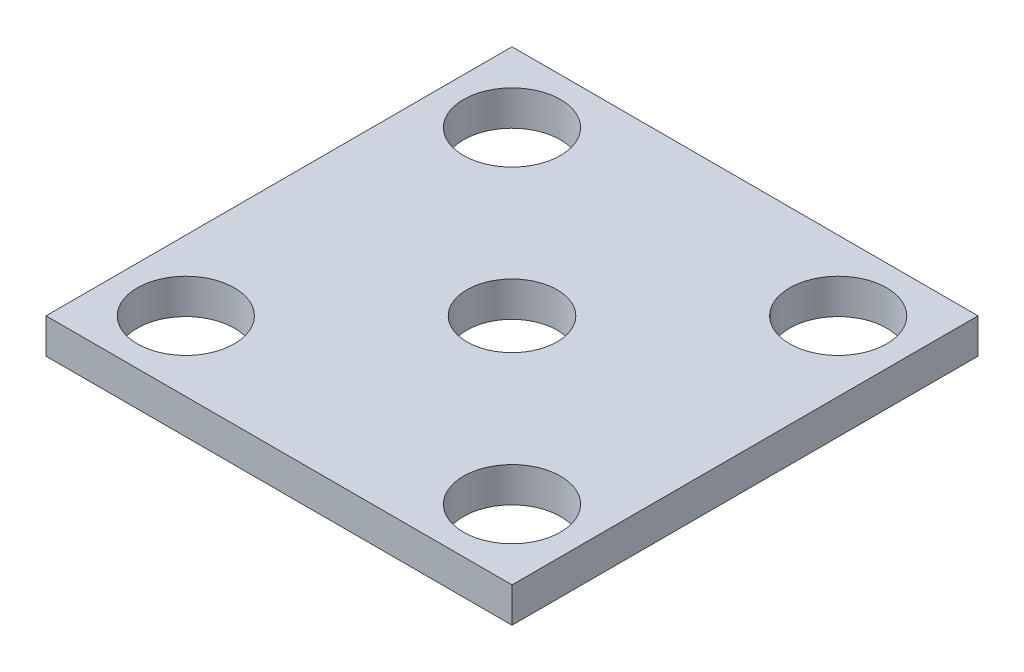
ISO-10303-21;
HEADER;
FILE_DESCRIPTION(('STEP AP214'),'2;1');
FILE_NAME('part.step','',(''),(''),'','','');
FILE_SCHEMA(('AUTOMOTIVE_DESIGN { 1 0 10303 214 1 1 1 1 }'));
ENDSEC;
DATA;
#1=APPLICATION_CONTEXT('core data for automotive mechanical design processes');
#2=APPLICATION_PROTOCOL_DEFINITION('international standard','automotive_design',2000,#1);
#3=PRODUCT_CONTEXT('',#1,'mechanical');
#4=PRODUCT('Part','Part','',(#3));
#5=PRODUCT_RELATED_PRODUCT_CATEGORY('part','',(#4));
#6=PRODUCT_DEFINITION_FORMATION('','',#4);
#7=PRODUCT_DEFINITION_CONTEXT('part definition',#1,'design');
#8=PRODUCT_DEFINITION('design','',#6,#7);
#9=PRODUCT_DEFINITION_SHAPE('','',#8);
#10=(LENGTH_UNIT() NAMED_UNIT(*) SI_UNIT(.MILLI.,.METRE.));
#11=(NAMED_UNIT(*) PLANE_ANGLE_UNIT() SI_UNIT($,.RADIAN.));
#12=(NAMED_UNIT(*) SI_UNIT($,.STERADIAN.) SOLID_ANGLE_UNIT());
#13=UNCERTAINTY_MEASURE_WITH_UNIT(LENGTH_MEASURE(1.E-05),#10,'distance_accuracy_value','');
#14=(GEOMETRIC_REPRESENTATION_CONTEXT(3) GLOBAL_UNCERTAINTY_ASSIGNED_CONTEXT((#13)) GLOBAL_UNIT_ASSIGNED_CONTEXT((#10,
#11,#12)) REPRESENTATION_CONTEXT('',''));
#15=CARTESIAN_POINT('',(0.,0.,0.));
#16=DIRECTION('',(0.,0.,1.));
#17=DIRECTION('',(1.,0.,0.));
#18=AXIS2_PLACEMENT_3D('',#15,#16,#17);
#19=CARTESIAN_POINT('',(0.,3.,0.));
#20=DIRECTION('',(0.,-1.,0.));
#21=DIRECTION('',(0.,0.,-1.));
#22=AXIS2_PLACEMENT_3D('',#19,#20,#21);
#23=PLANE('',#22);
#24=CARTESIAN_POINT('',(34.,3.,-6.));
#25=DIRECTION('',(0.,1.,0.));
#26=DIRECTION('',(0.,0.,1.));
#27=AXIS2_PLACEMENT_3D('',#24,#25,#26);
#28=CIRCLE('',#27,4.1656);
#29=CARTESIAN_POINT('',(34.,3.,-1.8344));
#30=VERTEX_POINT('',#29);
#31=EDGE_CURVE('E127',#30,#30,#28,.T.);
#32=ORIENTED_EDGE('',*,*,#31,.F.);
#33=EDGE_LOOP('',(#32));
#34=FACE_BOUND('',#33,.T.);
#35=CARTESIAN_POINT('',(6.,3.,-34.));
#36=DIRECTION('',(0.,1.,0.));
#37=DIRECTION('',(0.,0.,1.));
#38=AXIS2_PLACEMENT_3D('',#35,#36,#37);
#39=CIRCLE('',#38,4.1656);
#40=CARTESIAN_POINT('',(6.,3.,-29.8344));
#41=VERTEX_POINT('',#40);
#42=EDGE_CURVE('E115',#41,#41,#39,.T.);
#43=ORIENTED_EDGE('',*,*,#42,.F.);
#44=EDGE_LOOP('',(#43));
#45=FACE_BOUND('',#44,.T.);
#46=DIRECTION('',(0.,0.,1.));
#47=VECTOR('',#46,1.);
#48=CARTESIAN_POINT('',(0.,3.,0.));
#49=LINE('',#48,#47);
#50=CARTESIAN_POINT('',(0.,3.,-40.));
#51=VERTEX_POINT('',#50);
#52=CARTESIAN_POINT('',(0.,3.,0.));
#53=VERTEX_POINT('',#52);
#54=EDGE_CURVE('E85',#51,#53,#49,.T.);
#55=ORIENTED_EDGE('',*,*,#54,.T.);
#56=DIRECTION('',(1.,0.,0.));
#57=VECTOR('',#56,1.);
#58=CARTESIAN_POINT('',(0.,3.,0.));
#59=LINE('',#58,#57);
#60=CARTESIAN_POINT('',(40.,3.,0.));
#61=VERTEX_POINT('',#60);
#62=EDGE_CURVE('E80',#53,#61,#59,.T.);
#63=ORIENTED_EDGE('',*,*,#62,.T.);
#64=DIRECTION('',(0.,0.,-1.));
#65=VECTOR('',#64,1.);
#66=CARTESIAN_POINT('',(40.,3.,0.));
#67=LINE('',#66,#65);
#68=CARTESIAN_POINT('',(40.,3.,-40.));
#69=VERTEX_POINT('',#68);
#70=EDGE_CURVE('E83',#61,#69,#67,.T.);
#71=ORIENTED_EDGE('',*,*,#70,.T.);
#72=DIRECTION('',(-1.,0.,0.));
#73=VECTOR('',#72,1.);
#74=CARTESIAN_POINT('',(0.,3.,-40.));
#75=LINE('',#74,#73);
#76=EDGE_CURVE('E50',#69,#51,#75,.T.);
#77=ORIENTED_EDGE('',*,*,#76,.T.);
#78=EDGE_LOOP('',(#55,#63,#71,#77));
#79=FACE_BOUND('',#78,.T.);
#80=CARTESIAN_POINT('',(20.,3.,-20.));
#81=DIRECTION('',(0.,1.,0.));
#82=DIRECTION('',(0.,0.,1.));
#83=AXIS2_PLACEMENT_3D('',#80,#81,#82);
#84=CIRCLE('',#83,3.875);
#85=CARTESIAN_POINT('',(20.,3.,-16.125));
#86=VERTEX_POINT('',#85);
#87=EDGE_CURVE('E100',#86,#86,#84,.T.);
#88=ORIENTED_EDGE('',*,*,#87,.F.);
#89=EDGE_LOOP('',(#88));
#90=FACE_BOUND('',#89,.T.);
#91=CARTESIAN_POINT('',(6.,3.,-6.));
#92=DIRECTION('',(0.,1.,0.));
#93=DIRECTION('',(0.,0.,1.));
#94=AXIS2_PLACEMENT_3D('',#91,#92,#93);
#95=CIRCLE('',#94,4.1656);
#96=CARTESIAN_POINT('',(6.,3.,-1.8344));
#97=VERTEX_POINT('',#96);
#98=EDGE_CURVE('E121',#97,#97,#95,.T.);
#99=ORIENTED_EDGE('',*,*,#98,.F.);
#100=EDGE_LOOP('',(#99));
#101=FACE_BOUND('',#100,.T.);
#102=CARTESIAN_POINT('',(34.,3.,-34.));
#103=DIRECTION('',(0.,1.,0.));
#104=DIRECTION('',(0.,0.,1.));
#105=AXIS2_PLACEMENT_3D('',#102,#103,#104);
#106=CIRCLE('',#105,4.1656);
#107=CARTESIAN_POINT('',(34.,3.,-29.8344));
#108=VERTEX_POINT('',#107);
#109=EDGE_CURVE('E133',#108,#108,#106,.T.);
#110=ORIENTED_EDGE('',*,*,#109,.F.);
#111=EDGE_LOOP('',(#110));
#112=FACE_BOUND('',#111,.T.);
#113=ADVANCED_FACE('F33',(#34,#45,#79,#90,#101,#112),#23,.F.);
#114=CARTESIAN_POINT('',(0.,0.,0.));
#115=DIRECTION('',(0.,-1.,0.));
#116=DIRECTION('',(0.,0.,-1.));
#117=AXIS2_PLACEMENT_3D('',#114,#115,#116);
#118=PLANE('',#117);
#119=CARTESIAN_POINT('',(34.,0.,-6.));
#120=DIRECTION('',(0.,1.,0.));
#121=DIRECTION('',(0.,0.,1.));
#122=AXIS2_PLACEMENT_3D('',#119,#120,#121);
#123=CIRCLE('',#122,4.1656);
#124=CARTESIAN_POINT('',(34.,0.,-1.8344));
#125=VERTEX_POINT('',#124);
#126=EDGE_CURVE('E130',#125,#125,#123,.T.);
#127=ORIENTED_EDGE('',*,*,#126,.T.);
#128=EDGE_LOOP('',(#127));
#129=FACE_BOUND('',#128,.T.);
#130=CARTESIAN_POINT('',(6.,0.,-34.));
#131=DIRECTION('',(0.,1.,0.));
#132=DIRECTION('',(0.,0.,1.));
#133=AXIS2_PLACEMENT_3D('',#130,#131,#132);
#134=CIRCLE('',#133,4.1656);
#135=CARTESIAN_POINT('',(6.,0.,-29.8344));
#136=VERTEX_POINT('',#135);
#137=EDGE_CURVE('E118',#136,#136,#134,.T.);
#138=ORIENTED_EDGE('',*,*,#137,.T.);
#139=EDGE_LOOP('',(#138));
#140=FACE_BOUND('',#139,.T.);
#141=DIRECTION('',(0.,0.,1.));
#142=VECTOR('',#141,1.);
#143=CARTESIAN_POINT('',(0.,0.,0.));
#144=LINE('',#143,#142);
#145=CARTESIAN_POINT('',(0.,0.,-40.));
#146=VERTEX_POINT('',#145);
#147=CARTESIAN_POINT('',(0.,0.,0.));
#148=VERTEX_POINT('',#147);
#149=EDGE_CURVE('E97',#146,#148,#144,.T.);
#150=ORIENTED_EDGE('',*,*,#149,.F.);
#151=DIRECTION('',(-1.,0.,0.));
#152=VECTOR('',#151,1.);
#153=CARTESIAN_POINT('',(0.,0.,-40.));
#154=LINE('',#153,#152);
#155=CARTESIAN_POINT('',(40.,0.,-40.));
#156=VERTEX_POINT('',#155);
#157=EDGE_CURVE('E73',#156,#146,#154,.T.);
#158=ORIENTED_EDGE('',*,*,#157,.F.);
#159=DIRECTION('',(0.,0.,-1.));
#160=VECTOR('',#159,1.);
#161=CARTESIAN_POINT('',(40.,0.,0.));
#162=LINE('',#161,#160);
#163=CARTESIAN_POINT('',(40.,0.,0.));
#164=VERTEX_POINT('',#163);
#165=EDGE_CURVE('E67',#164,#156,#162,.T.);
#166=ORIENTED_EDGE('',*,*,#165,.F.);
#167=DIRECTION('',(1.,0.,0.));
#168=VECTOR('',#167,1.);
#169=CARTESIAN_POINT('',(0.,0.,0.));
#170=LINE('',#169,#168);
#171=EDGE_CURVE('E89',#148,#164,#170,.T.);
#172=ORIENTED_EDGE('',*,*,#171,.F.);
#173=EDGE_LOOP('',(#150,#158,#166,#172));
#174=FACE_BOUND('',#173,.T.);
#175=CARTESIAN_POINT('',(20.,0.,-20.));
#176=DIRECTION('',(0.,1.,0.));
#177=DIRECTION('',(0.,0.,1.));
#178=AXIS2_PLACEMENT_3D('',#175,#176,#177);
#179=CIRCLE('',#178,3.875);
#180=CARTESIAN_POINT('',(20.,0.,-16.125));
#181=VERTEX_POINT('',#180);
#182=EDGE_CURVE('E112',#181,#181,#179,.T.);
#183=ORIENTED_EDGE('',*,*,#182,.T.);
#184=EDGE_LOOP('',(#183));
#185=FACE_BOUND('',#184,.T.);
#186=CARTESIAN_POINT('',(6.,0.,-6.));
#187=DIRECTION('',(0.,1.,0.));
#188=DIRECTION('',(0.,0.,1.));
#189=AXIS2_PLACEMENT_3D('',#186,#187,#188);
#190=CIRCLE('',#189,4.1656);
#191=CARTESIAN_POINT('',(6.,0.,-1.8344));
#192=VERTEX_POINT('',#191);
#193=EDGE_CURVE('E124',#192,#192,#190,.T.);
#194=ORIENTED_EDGE('',*,*,#193,.T.);
#195=EDGE_LOOP('',(#194));
#196=FACE_BOUND('',#195,.T.);
#197=CARTESIAN_POINT('',(34.,0.,-34.));
#198=DIRECTION('',(0.,1.,0.));
#199=DIRECTION('',(0.,0.,1.));
#200=AXIS2_PLACEMENT_3D('',#197,#198,#199);
#201=CIRCLE('',#200,4.1656);
#202=CARTESIAN_POINT('',(34.,0.,-29.8344));
#203=VERTEX_POINT('',#202);
#204=EDGE_CURVE('E136',#203,#203,#201,.T.);
#205=ORIENTED_EDGE('',*,*,#204,.T.);
#206=EDGE_LOOP('',(#205));
#207=FACE_BOUND('',#206,.T.);
#208=ADVANCED_FACE('F108',(#129,#140,#174,#185,#196,#207),#118,.T.);
#209=CARTESIAN_POINT('',(0.,3.,0.));
#210=DIRECTION('',(1.,0.,0.));
#211=DIRECTION('',(0.,0.,-1.));
#212=AXIS2_PLACEMENT_3D('',#209,#210,#211);
#213=PLANE('',#212);
#214=ORIENTED_EDGE('',*,*,#149,.T.);
#215=DIRECTION('',(0.,-1.,0.));
#216=VECTOR('',#215,1.);
#217=CARTESIAN_POINT('',(0.,3.,0.));
#218=LINE('',#217,#216);
#219=EDGE_CURVE('E11',#53,#148,#218,.T.);
#220=ORIENTED_EDGE('',*,*,#219,.F.);
#221=ORIENTED_EDGE('',*,*,#54,.F.);
#222=DIRECTION('',(0.,-1.,0.));
#223=VECTOR('',#222,1.);
#224=CARTESIAN_POINT('',(0.,3.,-40.));
#225=LINE('',#224,#223);
#226=EDGE_CURVE('E93',#51,#146,#225,.T.);
#227=ORIENTED_EDGE('',*,*,#226,.T.);
#228=EDGE_LOOP('',(#214,#220,#221,#227));
#229=FACE_BOUND('',#228,.T.);
#230=ADVANCED_FACE('F35',(#229),#213,.F.);
#231=CARTESIAN_POINT('',(0.,3.,0.));
#232=DIRECTION('',(0.,0.,-1.));
#233=DIRECTION('',(-1.,0.,0.));
#234=AXIS2_PLACEMENT_3D('',#231,#232,#233);
#235=PLANE('',#234);
#236=ORIENTED_EDGE('',*,*,#171,.T.);
#237=DIRECTION('',(0.,-1.,0.));
#238=VECTOR('',#237,1.);
#239=CARTESIAN_POINT('',(40.,3.,0.));
#240=LINE('',#239,#238);
#241=EDGE_CURVE('E42',#61,#164,#240,.T.);
#242=ORIENTED_EDGE('',*,*,#241,.F.);
#243=ORIENTED_EDGE('',*,*,#62,.F.);
#244=ORIENTED_EDGE('',*,*,#219,.T.);
#245=EDGE_LOOP('',(#236,#242,#243,#244));
#246=FACE_BOUND('',#245,.T.);
#247=ADVANCED_FACE('F88',(#246),#235,.F.);
#248=CARTESIAN_POINT('',(40.,3.,0.));
#249=DIRECTION('',(-1.,0.,0.));
#250=DIRECTION('',(0.,0.,1.));
#251=AXIS2_PLACEMENT_3D('',#248,#249,#250);
#252=PLANE('',#251);
#253=ORIENTED_EDGE('',*,*,#165,.T.);
#254=DIRECTION('',(0.,-1.,0.));
#255=VECTOR('',#254,1.);
#256=CARTESIAN_POINT('',(40.,3.,-40.));
#257=LINE('',#256,#255);
#258=EDGE_CURVE('E90',#69,#156,#257,.T.);
#259=ORIENTED_EDGE('',*,*,#258,.F.);
#260=ORIENTED_EDGE('',*,*,#70,.F.);
#261=ORIENTED_EDGE('',*,*,#241,.T.);
#262=EDGE_LOOP('',(#253,#259,#260,#261));
#263=FACE_BOUND('',#262,.T.);
#264=ADVANCED_FACE('F91',(#263),#252,.F.);
#265=CARTESIAN_POINT('',(0.,3.,-40.));
#266=DIRECTION('',(0.,0.,1.));
#267=DIRECTION('',(1.,0.,0.));
#268=AXIS2_PLACEMENT_3D('',#265,#266,#267);
#269=PLANE('',#268);
#270=ORIENTED_EDGE('',*,*,#157,.T.);
#271=ORIENTED_EDGE('',*,*,#226,.F.);
#272=ORIENTED_EDGE('',*,*,#76,.F.);
#273=ORIENTED_EDGE('',*,*,#258,.T.);
#274=EDGE_LOOP('',(#270,#271,#272,#273));
#275=FACE_BOUND('',#274,.T.);
#276=ADVANCED_FACE('F105',(#275),#269,.F.);
#277=CARTESIAN_POINT('',(20.,3.,-20.));
#278=DIRECTION('',(0.,-1.,0.));
#279=DIRECTION('',(0.,0.,-1.));
#280=AXIS2_PLACEMENT_3D('',#277,#278,#279);
#281=CYLINDRICAL_SURFACE('',#280,3.875);
#282=ORIENTED_EDGE('',*,*,#87,.T.);
#283=EDGE_LOOP('',(#282));
#284=FACE_BOUND('',#283,.T.);
#285=ORIENTED_EDGE('',*,*,#182,.F.);
#286=EDGE_LOOP('',(#285));
#287=FACE_BOUND('',#286,.T.);
#288=ADVANCED_FACE('F156',(#284,#287),#281,.F.);
#289=CARTESIAN_POINT('',(6.,3.,-34.));
#290=DIRECTION('',(0.,-1.,0.));
#291=DIRECTION('',(0.,0.,-1.));
#292=AXIS2_PLACEMENT_3D('',#289,#290,#291);
#293=CYLINDRICAL_SURFACE('',#292,4.1656);
#294=ORIENTED_EDGE('',*,*,#42,.T.);
#295=EDGE_LOOP('',(#294));
#296=FACE_BOUND('',#295,.T.);
#297=ORIENTED_EDGE('',*,*,#137,.F.);
#298=EDGE_LOOP('',(#297));
#299=FACE_BOUND('',#298,.T.);
#300=ADVANCED_FACE('F202',(#296,#299),#293,.F.);
#301=CARTESIAN_POINT('',(6.,3.,-6.));
#302=DIRECTION('',(0.,-1.,0.));
#303=DIRECTION('',(0.,0.,-1.));
#304=AXIS2_PLACEMENT_3D('',#301,#302,#303);
#305=CYLINDRICAL_SURFACE('',#304,4.1656);
#306=ORIENTED_EDGE('',*,*,#98,.T.);
#307=EDGE_LOOP('',(#306));
#308=FACE_BOUND('',#307,.T.);
#309=ORIENTED_EDGE('',*,*,#193,.F.);
#310=EDGE_LOOP('',(#309));
#311=FACE_BOUND('',#310,.T.);
#312=ADVANCED_FACE('F210',(#308,#311),#305,.F.);
#313=CARTESIAN_POINT('',(34.,3.,-6.));
#314=DIRECTION('',(0.,-1.,0.));
#315=DIRECTION('',(0.,0.,-1.));
#316=AXIS2_PLACEMENT_3D('',#313,#314,#315);
#317=CYLINDRICAL_SURFACE('',#316,4.1656);
#318=ORIENTED_EDGE('',*,*,#31,.T.);
#319=EDGE_LOOP('',(#318));
#320=FACE_BOUND('',#319,.T.);
#321=ORIENTED_EDGE('',*,*,#126,.F.);
#322=EDGE_LOOP('',(#321));
#323=FACE_BOUND('',#322,.T.);
#324=ADVANCED_FACE('F218',(#320,#323),#317,.F.);
#325=CARTESIAN_POINT('',(34.,3.,-34.));
#326=DIRECTION('',(0.,-1.,0.));
#327=DIRECTION('',(0.,0.,-1.));
#328=AXIS2_PLACEMENT_3D('',#325,#326,#327);
#329=CYLINDRICAL_SURFACE('',#328,4.1656);
#330=ORIENTED_EDGE('',*,*,#109,.T.);
#331=EDGE_LOOP('',(#330));
#332=FACE_BOUND('',#331,.T.);
#333=ORIENTED_EDGE('',*,*,#204,.F.);
#334=EDGE_LOOP('',(#333));
#335=FACE_BOUND('',#334,.T.);
#336=ADVANCED_FACE('F142',(#332,#335),#329,.F.);
#337=CLOSED_SHELL('',(#113,#208,#230,#247,#264,#276,#288,#300,#312,#324,#336));
#338=MANIFOLD_SOLID_BREP('B2',#337);
#339=ADVANCED_BREP_SHAPE_REPRESENTATION('',(#18,#338),#14);
#340=SHAPE_DEFINITION_REPRESENTATION(#9,#339);
ENDSEC;
END-ISO-10303-21;
